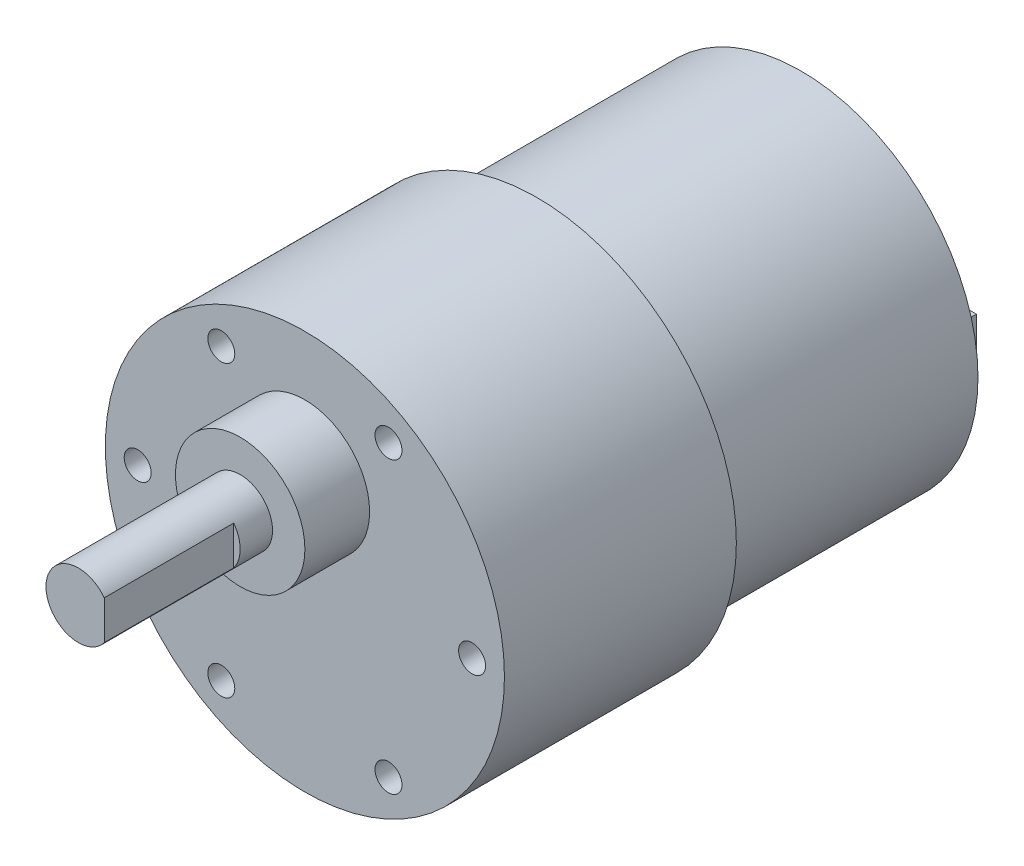
ISO-10303-21;
HEADER;
FILE_DESCRIPTION(('STEP AP214'),'2;1');
FILE_NAME('part.step','',(''),(''),'','','');
FILE_SCHEMA(('AUTOMOTIVE_DESIGN { 1 0 10303 214 1 1 1 1 }'));
ENDSEC;
DATA;
#1=APPLICATION_CONTEXT('core data for automotive mechanical design processes');
#2=APPLICATION_PROTOCOL_DEFINITION('international standard','automotive_design',2000,#1);
#3=PRODUCT_CONTEXT('',#1,'mechanical');
#4=PRODUCT('Part','Part','',(#3));
#5=PRODUCT_RELATED_PRODUCT_CATEGORY('part','',(#4));
#6=PRODUCT_DEFINITION_FORMATION('','',#4);
#7=PRODUCT_DEFINITION_CONTEXT('part definition',#1,'design');
#8=PRODUCT_DEFINITION('design','',#6,#7);
#9=PRODUCT_DEFINITION_SHAPE('','',#8);
#10=(LENGTH_UNIT() NAMED_UNIT(*) SI_UNIT(.MILLI.,.METRE.));
#11=(NAMED_UNIT(*) PLANE_ANGLE_UNIT() SI_UNIT($,.RADIAN.));
#12=(NAMED_UNIT(*) SI_UNIT($,.STERADIAN.) SOLID_ANGLE_UNIT());
#13=UNCERTAINTY_MEASURE_WITH_UNIT(LENGTH_MEASURE(1.E-05),#10,'distance_accuracy_value','');
#14=(GEOMETRIC_REPRESENTATION_CONTEXT(3) GLOBAL_UNCERTAINTY_ASSIGNED_CONTEXT((#13)) GLOBAL_UNIT_ASSIGNED_CONTEXT((#10,
#11,#12)) REPRESENTATION_CONTEXT('',''));
#15=CARTESIAN_POINT('',(0.,0.,0.));
#16=DIRECTION('',(0.,0.,1.));
#17=DIRECTION('',(1.,0.,0.));
#18=AXIS2_PLACEMENT_3D('',#15,#16,#17);
#19=CARTESIAN_POINT('',(0.,0.,-46.));
#20=DIRECTION('',(0.,0.,1.));
#21=DIRECTION('',(1.,0.,0.));
#22=AXIS2_PLACEMENT_3D('',#19,#20,#21);
#23=PLANE('',#22);
#24=CARTESIAN_POINT('',(0.,0.,-46.));
#25=DIRECTION('',(0.,0.,1.));
#26=DIRECTION('',(1.,0.,0.));
#27=AXIS2_PLACEMENT_3D('',#24,#25,#26);
#28=CIRCLE('',#27,16.4);
#29=CARTESIAN_POINT('',(16.4,0.,-46.));
#30=VERTEX_POINT('',#29);
#31=EDGE_CURVE('E168',#30,#30,#28,.T.);
#32=ORIENTED_EDGE('',*,*,#31,.F.);
#33=EDGE_LOOP('',(#32));
#34=FACE_BOUND('',#33,.T.);
#35=DIRECTION('',(-1.,0.,0.));
#36=VECTOR('',#35,1.);
#37=CARTESIAN_POINT('',(-6.75,-4.5,-46.));
#38=LINE('',#37,#36);
#39=CARTESIAN_POINT('',(6.75,-4.5,-46.));
#40=VERTEX_POINT('',#39);
#41=CARTESIAN_POINT('',(5.03115294937453,-4.5,-46.));
#42=VERTEX_POINT('',#41);
#43=EDGE_CURVE('E133',#40,#42,#38,.T.);
#44=ORIENTED_EDGE('',*,*,#43,.T.);
#45=CARTESIAN_POINT('',(0.,0.,-46.));
#46=DIRECTION('',(0.,0.,1.));
#47=DIRECTION('',(1.,0.,0.));
#48=AXIS2_PLACEMENT_3D('',#45,#46,#47);
#49=CIRCLE('',#48,6.75);
#50=CARTESIAN_POINT('',(-5.03115294937453,-4.5,-46.));
#51=VERTEX_POINT('',#50);
#52=EDGE_CURVE('E165',#42,#51,#49,.T.);
#53=ORIENTED_EDGE('',*,*,#52,.T.);
#54=CARTESIAN_POINT('',(-6.75,-4.5,-46.));
#55=VERTEX_POINT('',#54);
#56=EDGE_CURVE('E131',#51,#55,#38,.T.);
#57=ORIENTED_EDGE('',*,*,#56,.T.);
#58=DIRECTION('',(0.,-1.,0.));
#59=VECTOR('',#58,1.);
#60=CARTESIAN_POINT('',(-6.75,-11.5,-46.));
#61=LINE('',#60,#59);
#62=CARTESIAN_POINT('',(-6.75,-11.5,-46.));
#63=VERTEX_POINT('',#62);
#64=EDGE_CURVE('E135',#55,#63,#61,.T.);
#65=ORIENTED_EDGE('',*,*,#64,.T.);
#66=DIRECTION('',(1.,0.,0.));
#67=VECTOR('',#66,1.);
#68=CARTESIAN_POINT('',(-6.75,-11.5,-46.));
#69=LINE('',#68,#67);
#70=CARTESIAN_POINT('',(6.75,-11.5,-46.));
#71=VERTEX_POINT('',#70);
#72=EDGE_CURVE('E137',#63,#71,#69,.T.);
#73=ORIENTED_EDGE('',*,*,#72,.T.);
#74=DIRECTION('',(0.,1.,0.));
#75=VECTOR('',#74,1.);
#76=CARTESIAN_POINT('',(6.75,-11.5,-46.));
#77=LINE('',#76,#75);
#78=EDGE_CURVE('E58',#71,#40,#77,.T.);
#79=ORIENTED_EDGE('',*,*,#78,.T.);
#80=EDGE_LOOP('',(#44,#53,#57,#65,#73,#79));
#81=FACE_BOUND('',#80,.T.);
#82=ADVANCED_FACE('F35',(#34,#81),#23,.F.);
#83=CARTESIAN_POINT('',(0.,0.,-46.));
#84=DIRECTION('',(0.,0.,-1.));
#85=DIRECTION('',(-1.,0.,0.));
#86=AXIS2_PLACEMENT_3D('',#83,#84,#85);
#87=CYLINDRICAL_SURFACE('',#86,6.75);
#88=DIRECTION('',(0.,0.,-1.));
#89=VECTOR('',#88,1.);
#90=CARTESIAN_POINT('',(-5.03115294937453,-4.5,-46.));
#91=LINE('',#90,#89);
#92=CARTESIAN_POINT('',(-5.03115294937453,-4.5,-50.));
#93=VERTEX_POINT('',#92);
#94=EDGE_CURVE('E161',#51,#93,#91,.T.);
#95=ORIENTED_EDGE('',*,*,#94,.F.);
#96=ORIENTED_EDGE('',*,*,#52,.F.);
#97=DIRECTION('',(0.,0.,-1.));
#98=VECTOR('',#97,1.);
#99=CARTESIAN_POINT('',(5.03115294937453,-4.5,-46.));
#100=LINE('',#99,#98);
#101=CARTESIAN_POINT('',(5.03115294937453,-4.5,-50.));
#102=VERTEX_POINT('',#101);
#103=EDGE_CURVE('E158',#102,#42,#100,.F.);
#104=ORIENTED_EDGE('',*,*,#103,.F.);
#105=CARTESIAN_POINT('',(0.,0.,-50.));
#106=DIRECTION('',(0.,0.,1.));
#107=DIRECTION('',(1.,0.,0.));
#108=AXIS2_PLACEMENT_3D('',#105,#106,#107);
#109=CIRCLE('',#108,6.75);
#110=EDGE_CURVE('E164',#102,#93,#109,.T.);
#111=ORIENTED_EDGE('',*,*,#110,.T.);
#112=EDGE_LOOP('',(#95,#96,#104,#111));
#113=FACE_BOUND('',#112,.T.);
#114=ADVANCED_FACE('F198',(#113),#87,.T.);
#115=CARTESIAN_POINT('',(0.,0.,-50.));
#116=DIRECTION('',(0.,0.,1.));
#117=DIRECTION('',(1.,0.,0.));
#118=AXIS2_PLACEMENT_3D('',#115,#116,#117);
#119=PLANE('',#118);
#120=DIRECTION('',(1.,0.,0.));
#121=VECTOR('',#120,1.);
#122=CARTESIAN_POINT('',(0.,-4.5,-50.));
#123=LINE('',#122,#121);
#124=EDGE_CURVE('E39',#93,#102,#123,.T.);
#125=ORIENTED_EDGE('',*,*,#124,.F.);
#126=ORIENTED_EDGE('',*,*,#110,.F.);
#127=EDGE_LOOP('',(#125,#126));
#128=FACE_BOUND('',#127,.T.);
#129=ADVANCED_FACE('F204',(#128),#119,.F.);
#130=CARTESIAN_POINT('',(0.,0.,0.));
#131=DIRECTION('',(0.,0.,-1.));
#132=DIRECTION('',(-1.,0.,0.));
#133=AXIS2_PLACEMENT_3D('',#130,#131,#132);
#134=CYLINDRICAL_SURFACE('',#133,18.5);
#135=CARTESIAN_POINT('',(0.,0.,0.));
#136=DIRECTION('',(0.,0.,1.));
#137=DIRECTION('',(1.,0.,0.));
#138=AXIS2_PLACEMENT_3D('',#135,#136,#137);
#139=CIRCLE('',#138,18.5);
#140=CARTESIAN_POINT('',(18.5,0.,0.));
#141=VERTEX_POINT('',#140);
#142=EDGE_CURVE('E177',#141,#141,#139,.T.);
#143=ORIENTED_EDGE('',*,*,#142,.F.);
#144=EDGE_LOOP('',(#143));
#145=FACE_BOUND('',#144,.T.);
#146=CARTESIAN_POINT('',(0.,0.,-21.5));
#147=DIRECTION('',(0.,0.,1.));
#148=DIRECTION('',(1.,0.,0.));
#149=AXIS2_PLACEMENT_3D('',#146,#147,#148);
#150=CIRCLE('',#149,18.5);
#151=CARTESIAN_POINT('',(18.5,0.,-21.5));
#152=VERTEX_POINT('',#151);
#153=EDGE_CURVE('E176',#152,#152,#150,.T.);
#154=ORIENTED_EDGE('',*,*,#153,.T.);
#155=EDGE_LOOP('',(#154));
#156=FACE_BOUND('',#155,.T.);
#157=ADVANCED_FACE('F37',(#145,#156),#134,.T.);
#158=CARTESIAN_POINT('',(0.,0.,0.));
#159=DIRECTION('',(0.,0.,1.));
#160=DIRECTION('',(1.,0.,0.));
#161=AXIS2_PLACEMENT_3D('',#158,#159,#160);
#162=PLANE('',#161);
#163=CARTESIAN_POINT('',(15.5,0.,0.));
#164=DIRECTION('',(0.,0.,1.));
#165=DIRECTION('',(1.,0.,0.));
#166=AXIS2_PLACEMENT_3D('',#163,#164,#165);
#167=CIRCLE('',#166,1.25);
#168=CARTESIAN_POINT('',(16.75,0.,0.));
#169=VERTEX_POINT('',#168);
#170=EDGE_CURVE('E300',#169,#169,#167,.T.);
#171=ORIENTED_EDGE('',*,*,#170,.F.);
#172=EDGE_LOOP('',(#171));
#173=FACE_BOUND('',#172,.T.);
#174=CARTESIAN_POINT('',(7.75,-13.4233937586588,0.));
#175=DIRECTION('',(0.,0.,1.));
#176=DIRECTION('',(1.,0.,0.));
#177=AXIS2_PLACEMENT_3D('',#174,#175,#176);
#178=CIRCLE('',#177,1.25);
#179=CARTESIAN_POINT('',(9.,-13.4233937586588,0.));
#180=VERTEX_POINT('',#179);
#181=EDGE_CURVE('E310',#180,#180,#178,.T.);
#182=ORIENTED_EDGE('',*,*,#181,.F.);
#183=EDGE_LOOP('',(#182));
#184=FACE_BOUND('',#183,.T.);
#185=CARTESIAN_POINT('',(-7.75,-13.4233937586588,0.));
#186=DIRECTION('',(0.,0.,1.));
#187=DIRECTION('',(1.,0.,0.));
#188=AXIS2_PLACEMENT_3D('',#185,#186,#187);
#189=CIRCLE('',#188,1.24999999999999);
#190=CARTESIAN_POINT('',(-6.50000000000001,-13.4233937586588,0.));
#191=VERTEX_POINT('',#190);
#192=EDGE_CURVE('E309',#191,#191,#189,.T.);
#193=ORIENTED_EDGE('',*,*,#192,.F.);
#194=EDGE_LOOP('',(#193));
#195=FACE_BOUND('',#194,.T.);
#196=CARTESIAN_POINT('',(-15.5,0.,0.));
#197=DIRECTION('',(0.,0.,1.));
#198=DIRECTION('',(1.,0.,0.));
#199=AXIS2_PLACEMENT_3D('',#196,#197,#198);
#200=CIRCLE('',#199,1.25);
#201=CARTESIAN_POINT('',(-14.25,0.,0.));
#202=VERTEX_POINT('',#201);
#203=EDGE_CURVE('E327',#202,#202,#200,.T.);
#204=ORIENTED_EDGE('',*,*,#203,.F.);
#205=EDGE_LOOP('',(#204));
#206=FACE_BOUND('',#205,.T.);
#207=CARTESIAN_POINT('',(-7.75,13.4233937586588,0.));
#208=DIRECTION('',(0.,0.,1.));
#209=DIRECTION('',(1.,0.,0.));
#210=AXIS2_PLACEMENT_3D('',#207,#208,#209);
#211=CIRCLE('',#210,1.25);
#212=CARTESIAN_POINT('',(-6.5,13.4233937586588,0.));
#213=VERTEX_POINT('',#212);
#214=EDGE_CURVE('E321',#213,#213,#211,.T.);
#215=ORIENTED_EDGE('',*,*,#214,.F.);
#216=EDGE_LOOP('',(#215));
#217=FACE_BOUND('',#216,.T.);
#218=CARTESIAN_POINT('',(7.75,13.4233937586588,0.));
#219=DIRECTION('',(0.,0.,1.));
#220=DIRECTION('',(1.,0.,0.));
#221=AXIS2_PLACEMENT_3D('',#218,#219,#220);
#222=CIRCLE('',#221,1.25);
#223=CARTESIAN_POINT('',(9.,13.4233937586588,0.));
#224=VERTEX_POINT('',#223);
#225=EDGE_CURVE('E315',#224,#224,#222,.T.);
#226=ORIENTED_EDGE('',*,*,#225,.F.);
#227=EDGE_LOOP('',(#226));
#228=FACE_BOUND('',#227,.T.);
#229=CARTESIAN_POINT('',(0.,7.,0.));
#230=DIRECTION('',(0.,0.,1.));
#231=DIRECTION('',(1.,0.,0.));
#232=AXIS2_PLACEMENT_3D('',#229,#230,#231);
#233=CIRCLE('',#232,6.);
#234=CARTESIAN_POINT('',(6.,7.,0.));
#235=VERTEX_POINT('',#234);
#236=EDGE_CURVE('E119',#235,#235,#233,.T.);
#237=ORIENTED_EDGE('',*,*,#236,.F.);
#238=EDGE_LOOP('',(#237));
#239=FACE_BOUND('',#238,.T.);
#240=ORIENTED_EDGE('',*,*,#142,.T.);
#241=EDGE_LOOP('',(#240));
#242=FACE_BOUND('',#241,.T.);
#243=ADVANCED_FACE('F186',(#173,#184,#195,#206,#217,#228,#239,#242),#162,.T.);
#244=CARTESIAN_POINT('',(0.,0.,-21.5));
#245=DIRECTION('',(0.,0.,1.));
#246=DIRECTION('',(1.,0.,0.));
#247=AXIS2_PLACEMENT_3D('',#244,#245,#246);
#248=PLANE('',#247);
#249=CARTESIAN_POINT('',(0.,0.,-21.5));
#250=DIRECTION('',(0.,0.,1.));
#251=DIRECTION('',(1.,0.,0.));
#252=AXIS2_PLACEMENT_3D('',#249,#250,#251);
#253=CIRCLE('',#252,16.4);
#254=CARTESIAN_POINT('',(16.4,0.,-21.5));
#255=VERTEX_POINT('',#254);
#256=EDGE_CURVE('E173',#255,#255,#253,.T.);
#257=ORIENTED_EDGE('',*,*,#256,.T.);
#258=EDGE_LOOP('',(#257));
#259=FACE_BOUND('',#258,.T.);
#260=ORIENTED_EDGE('',*,*,#153,.F.);
#261=EDGE_LOOP('',(#260));
#262=FACE_BOUND('',#261,.T.);
#263=ADVANCED_FACE('F183',(#259,#262),#248,.F.);
#264=CARTESIAN_POINT('',(0.,0.,-21.5));
#265=DIRECTION('',(0.,0.,-1.));
#266=DIRECTION('',(-1.,0.,0.));
#267=AXIS2_PLACEMENT_3D('',#264,#265,#266);
#268=CYLINDRICAL_SURFACE('',#267,16.4);
#269=ORIENTED_EDGE('',*,*,#256,.F.);
#270=EDGE_LOOP('',(#269));
#271=FACE_BOUND('',#270,.T.);
#272=ORIENTED_EDGE('',*,*,#31,.T.);
#273=EDGE_LOOP('',(#272));
#274=FACE_BOUND('',#273,.T.);
#275=ADVANCED_FACE('F185',(#271,#274),#268,.T.);
#276=CARTESIAN_POINT('',(-6.75,-4.5,-46.));
#277=DIRECTION('',(0.,-1.,0.));
#278=DIRECTION('',(0.,0.,-1.));
#279=AXIS2_PLACEMENT_3D('',#276,#277,#278);
#280=PLANE('',#279);
#281=ORIENTED_EDGE('',*,*,#56,.F.);
#282=ORIENTED_EDGE('',*,*,#94,.T.);
#283=ORIENTED_EDGE('',*,*,#124,.T.);
#284=ORIENTED_EDGE('',*,*,#103,.T.);
#285=ORIENTED_EDGE('',*,*,#43,.F.);
#286=DIRECTION('',(0.,0.,-1.));
#287=VECTOR('',#286,1.);
#288=CARTESIAN_POINT('',(6.75,-4.5,-46.));
#289=LINE('',#288,#287);
#290=CARTESIAN_POINT('',(6.75,-4.5,-55.5));
#291=VERTEX_POINT('',#290);
#292=EDGE_CURVE('E155',#40,#291,#289,.T.);
#293=ORIENTED_EDGE('',*,*,#292,.T.);
#294=DIRECTION('',(-1.,0.,0.));
#295=VECTOR('',#294,1.);
#296=CARTESIAN_POINT('',(-6.75,-4.5,-55.5));
#297=LINE('',#296,#295);
#298=CARTESIAN_POINT('',(-6.75,-4.5,-55.5));
#299=VERTEX_POINT('',#298);
#300=EDGE_CURVE('E142',#291,#299,#297,.T.);
#301=ORIENTED_EDGE('',*,*,#300,.T.);
#302=DIRECTION('',(0.,0.,-1.));
#303=VECTOR('',#302,1.);
#304=CARTESIAN_POINT('',(-6.75,-4.5,-46.));
#305=LINE('',#304,#303);
#306=EDGE_CURVE('E152',#55,#299,#305,.T.);
#307=ORIENTED_EDGE('',*,*,#306,.F.);
#308=EDGE_LOOP('',(#281,#282,#283,#284,#285,#293,#301,#307));
#309=FACE_BOUND('',#308,.T.);
#310=ADVANCED_FACE('F192',(#309),#280,.F.);
#311=CARTESIAN_POINT('',(6.75,-11.5,-46.));
#312=DIRECTION('',(-1.,0.,0.));
#313=DIRECTION('',(0.,0.,1.));
#314=AXIS2_PLACEMENT_3D('',#311,#312,#313);
#315=PLANE('',#314);
#316=DIRECTION('',(0.,1.,0.));
#317=VECTOR('',#316,1.);
#318=CARTESIAN_POINT('',(6.75,-11.5,-55.5));
#319=LINE('',#318,#317);
#320=CARTESIAN_POINT('',(6.75,-11.5,-55.5));
#321=VERTEX_POINT('',#320);
#322=EDGE_CURVE('E127',#321,#291,#319,.T.);
#323=ORIENTED_EDGE('',*,*,#322,.T.);
#324=ORIENTED_EDGE('',*,*,#292,.F.);
#325=ORIENTED_EDGE('',*,*,#78,.F.);
#326=DIRECTION('',(0.,0.,-1.));
#327=VECTOR('',#326,1.);
#328=CARTESIAN_POINT('',(6.75,-11.5,-46.));
#329=LINE('',#328,#327);
#330=EDGE_CURVE('E139',#71,#321,#329,.T.);
#331=ORIENTED_EDGE('',*,*,#330,.T.);
#332=EDGE_LOOP('',(#323,#324,#325,#331));
#333=FACE_BOUND('',#332,.T.);
#334=ADVANCED_FACE('F212',(#333),#315,.F.);
#335=CARTESIAN_POINT('',(-6.75,-11.5,-46.));
#336=DIRECTION('',(1.,0.,0.));
#337=DIRECTION('',(0.,0.,-1.));
#338=AXIS2_PLACEMENT_3D('',#335,#336,#337);
#339=PLANE('',#338);
#340=DIRECTION('',(0.,-1.,0.));
#341=VECTOR('',#340,1.);
#342=CARTESIAN_POINT('',(-6.75,-11.5,-55.5));
#343=LINE('',#342,#341);
#344=CARTESIAN_POINT('',(-6.75,-11.5,-55.5));
#345=VERTEX_POINT('',#344);
#346=EDGE_CURVE('E144',#299,#345,#343,.T.);
#347=ORIENTED_EDGE('',*,*,#346,.T.);
#348=DIRECTION('',(0.,0.,-1.));
#349=VECTOR('',#348,1.);
#350=CARTESIAN_POINT('',(-6.75,-11.5,-46.));
#351=LINE('',#350,#349);
#352=EDGE_CURVE('E149',#63,#345,#351,.T.);
#353=ORIENTED_EDGE('',*,*,#352,.F.);
#354=ORIENTED_EDGE('',*,*,#64,.F.);
#355=ORIENTED_EDGE('',*,*,#306,.T.);
#356=EDGE_LOOP('',(#347,#353,#354,#355));
#357=FACE_BOUND('',#356,.T.);
#358=ADVANCED_FACE('F215',(#357),#339,.F.);
#359=CARTESIAN_POINT('',(-6.75,-11.5,-46.));
#360=DIRECTION('',(0.,1.,0.));
#361=DIRECTION('',(0.,0.,1.));
#362=AXIS2_PLACEMENT_3D('',#359,#360,#361);
#363=PLANE('',#362);
#364=DIRECTION('',(1.,0.,0.));
#365=VECTOR('',#364,1.);
#366=CARTESIAN_POINT('',(-6.75,-11.5,-55.5));
#367=LINE('',#366,#365);
#368=EDGE_CURVE('E132',#345,#321,#367,.T.);
#369=ORIENTED_EDGE('',*,*,#368,.T.);
#370=ORIENTED_EDGE('',*,*,#330,.F.);
#371=ORIENTED_EDGE('',*,*,#72,.F.);
#372=ORIENTED_EDGE('',*,*,#352,.T.);
#373=EDGE_LOOP('',(#369,#370,#371,#372));
#374=FACE_BOUND('',#373,.T.);
#375=ADVANCED_FACE('F222',(#374),#363,.F.);
#376=CARTESIAN_POINT('',(0.,0.,-55.5));
#377=DIRECTION('',(0.,0.,-1.));
#378=DIRECTION('',(-1.,0.,0.));
#379=AXIS2_PLACEMENT_3D('',#376,#377,#378);
#380=PLANE('',#379);
#381=ORIENTED_EDGE('',*,*,#322,.F.);
#382=ORIENTED_EDGE('',*,*,#368,.F.);
#383=ORIENTED_EDGE('',*,*,#346,.F.);
#384=ORIENTED_EDGE('',*,*,#300,.F.);
#385=EDGE_LOOP('',(#381,#382,#383,#384));
#386=FACE_BOUND('',#385,.T.);
#387=ADVANCED_FACE('F226',(#386),#380,.T.);
#388=CARTESIAN_POINT('',(0.,7.,6.));
#389=DIRECTION('',(0.,0.,-1.));
#390=DIRECTION('',(-1.,0.,0.));
#391=AXIS2_PLACEMENT_3D('',#388,#389,#390);
#392=CYLINDRICAL_SURFACE('',#391,6.);
#393=CARTESIAN_POINT('',(0.,7.,6.));
#394=DIRECTION('',(0.,0.,1.));
#395=DIRECTION('',(1.,0.,0.));
#396=AXIS2_PLACEMENT_3D('',#393,#394,#395);
#397=CIRCLE('',#396,6.);
#398=CARTESIAN_POINT('',(6.,7.,6.));
#399=VERTEX_POINT('',#398);
#400=EDGE_CURVE('E124',#399,#399,#397,.T.);
#401=ORIENTED_EDGE('',*,*,#400,.F.);
#402=EDGE_LOOP('',(#401));
#403=FACE_BOUND('',#402,.T.);
#404=ORIENTED_EDGE('',*,*,#236,.T.);
#405=EDGE_LOOP('',(#404));
#406=FACE_BOUND('',#405,.T.);
#407=ADVANCED_FACE('F230',(#403,#406),#392,.T.);
#408=CARTESIAN_POINT('',(0.,7.,6.));
#409=DIRECTION('',(0.,0.,1.));
#410=DIRECTION('',(1.,0.,0.));
#411=AXIS2_PLACEMENT_3D('',#408,#409,#410);
#412=PLANE('',#411);
#413=CARTESIAN_POINT('',(0.,7.,6.));
#414=DIRECTION('',(0.,0.,1.));
#415=DIRECTION('',(1.,0.,0.));
#416=AXIS2_PLACEMENT_3D('',#413,#414,#415);
#417=CIRCLE('',#416,3.);
#418=CARTESIAN_POINT('',(3.,7.,6.));
#419=VERTEX_POINT('',#418);
#420=EDGE_CURVE('E11',#419,#419,#417,.T.);
#421=ORIENTED_EDGE('',*,*,#420,.F.);
#422=EDGE_LOOP('',(#421));
#423=FACE_BOUND('',#422,.T.);
#424=ORIENTED_EDGE('',*,*,#400,.T.);
#425=EDGE_LOOP('',(#424));
#426=FACE_BOUND('',#425,.T.);
#427=ADVANCED_FACE('F234',(#423,#426),#412,.T.);
#428=CARTESIAN_POINT('',(0.,7.,9.));
#429=DIRECTION('',(0.,0.,-1.));
#430=DIRECTION('',(-1.,0.,0.));
#431=AXIS2_PLACEMENT_3D('',#428,#429,#430);
#432=CYLINDRICAL_SURFACE('',#431,3.);
#433=CARTESIAN_POINT('',(0.,7.,9.));
#434=DIRECTION('',(0.,0.,1.));
#435=DIRECTION('',(1.,0.,0.));
#436=AXIS2_PLACEMENT_3D('',#433,#434,#435);
#437=CIRCLE('',#436,3.);
#438=CARTESIAN_POINT('',(2.4,5.2,9.));
#439=VERTEX_POINT('',#438);
#440=CARTESIAN_POINT('',(2.4,8.8,9.));
#441=VERTEX_POINT('',#440);
#442=EDGE_CURVE('E117',#439,#441,#437,.T.);
#443=ORIENTED_EDGE('',*,*,#442,.F.);
#444=DIRECTION('',(0.,0.,-1.));
#445=VECTOR('',#444,1.);
#446=CARTESIAN_POINT('',(2.4,5.2,21.));
#447=LINE('',#446,#445);
#448=CARTESIAN_POINT('',(2.4,5.2,21.));
#449=VERTEX_POINT('',#448);
#450=EDGE_CURVE('E105',#449,#439,#447,.T.);
#451=ORIENTED_EDGE('',*,*,#450,.F.);
#452=CARTESIAN_POINT('',(0.,7.,21.));
#453=DIRECTION('',(0.,0.,1.));
#454=DIRECTION('',(1.,0.,0.));
#455=AXIS2_PLACEMENT_3D('',#452,#453,#454);
#456=CIRCLE('',#455,3.);
#457=CARTESIAN_POINT('',(2.4,8.8,21.));
#458=VERTEX_POINT('',#457);
#459=EDGE_CURVE('E110',#458,#449,#456,.T.);
#460=ORIENTED_EDGE('',*,*,#459,.F.);
#461=DIRECTION('',(0.,0.,-1.));
#462=VECTOR('',#461,1.);
#463=CARTESIAN_POINT('',(2.4,8.8,21.));
#464=LINE('',#463,#462);
#465=EDGE_CURVE('E107',#458,#441,#464,.T.);
#466=ORIENTED_EDGE('',*,*,#465,.T.);
#467=EDGE_LOOP('',(#443,#451,#460,#466));
#468=FACE_BOUND('',#467,.T.);
#469=ORIENTED_EDGE('',*,*,#420,.T.);
#470=EDGE_LOOP('',(#469));
#471=FACE_BOUND('',#470,.T.);
#472=ADVANCED_FACE('F115',(#468,#471),#432,.T.);
#473=CARTESIAN_POINT('',(0.,7.,9.));
#474=DIRECTION('',(0.,0.,1.));
#475=DIRECTION('',(1.,0.,0.));
#476=AXIS2_PLACEMENT_3D('',#473,#474,#475);
#477=PLANE('',#476);
#478=DIRECTION('',(0.,1.,0.));
#479=VECTOR('',#478,1.);
#480=CARTESIAN_POINT('',(2.4,5.2,9.));
#481=LINE('',#480,#479);
#482=EDGE_CURVE('E50',#439,#441,#481,.T.);
#483=ORIENTED_EDGE('',*,*,#482,.F.);
#484=ORIENTED_EDGE('',*,*,#442,.T.);
#485=EDGE_LOOP('',(#483,#484));
#486=FACE_BOUND('',#485,.T.);
#487=ADVANCED_FACE('F241',(#486),#477,.T.);
#488=CARTESIAN_POINT('',(2.4,5.2,21.));
#489=DIRECTION('',(-1.,0.,0.));
#490=DIRECTION('',(0.,0.,1.));
#491=AXIS2_PLACEMENT_3D('',#488,#489,#490);
#492=PLANE('',#491);
#493=ORIENTED_EDGE('',*,*,#482,.T.);
#494=ORIENTED_EDGE('',*,*,#465,.F.);
#495=DIRECTION('',(0.,1.,0.));
#496=VECTOR('',#495,1.);
#497=CARTESIAN_POINT('',(2.4,5.2,21.));
#498=LINE('',#497,#496);
#499=EDGE_CURVE('E101',#449,#458,#498,.T.);
#500=ORIENTED_EDGE('',*,*,#499,.F.);
#501=ORIENTED_EDGE('',*,*,#450,.T.);
#502=EDGE_LOOP('',(#493,#494,#500,#501));
#503=FACE_BOUND('',#502,.T.);
#504=ADVANCED_FACE('F103',(#503),#492,.F.);
#505=CARTESIAN_POINT('',(0.,7.,21.));
#506=DIRECTION('',(0.,0.,1.));
#507=DIRECTION('',(1.,0.,0.));
#508=AXIS2_PLACEMENT_3D('',#505,#506,#507);
#509=PLANE('',#508);
#510=ORIENTED_EDGE('',*,*,#459,.T.);
#511=ORIENTED_EDGE('',*,*,#499,.T.);
#512=EDGE_LOOP('',(#510,#511));
#513=FACE_BOUND('',#512,.T.);
#514=ADVANCED_FACE('F112',(#513),#509,.T.);
#515=CARTESIAN_POINT('',(7.75,13.4233937586588,-3.));
#516=DIRECTION('',(0.,0.,1.));
#517=DIRECTION('',(1.,0.,0.));
#518=AXIS2_PLACEMENT_3D('',#515,#516,#517);
#519=CYLINDRICAL_SURFACE('',#518,1.25);
#520=CARTESIAN_POINT('',(7.75,13.4233937586588,-3.));
#521=DIRECTION('',(0.,0.,1.));
#522=DIRECTION('',(1.,0.,0.));
#523=AXIS2_PLACEMENT_3D('',#520,#521,#522);
#524=CIRCLE('',#523,1.25);
#525=CARTESIAN_POINT('',(9.,13.4233937586588,-3.));
#526=VERTEX_POINT('',#525);
#527=EDGE_CURVE('E303',#526,#526,#524,.T.);
#528=ORIENTED_EDGE('',*,*,#527,.F.);
#529=EDGE_LOOP('',(#528));
#530=FACE_BOUND('',#529,.T.);
#531=ORIENTED_EDGE('',*,*,#225,.T.);
#532=EDGE_LOOP('',(#531));
#533=FACE_BOUND('',#532,.T.);
#534=ADVANCED_FACE('F248',(#530,#533),#519,.F.);
#535=CARTESIAN_POINT('',(7.75,13.4233937586588,-3.));
#536=DIRECTION('',(0.,0.,1.));
#537=DIRECTION('',(1.,0.,0.));
#538=AXIS2_PLACEMENT_3D('',#535,#536,#537);
#539=PLANE('',#538);
#540=ORIENTED_EDGE('',*,*,#527,.T.);
#541=EDGE_LOOP('',(#540));
#542=FACE_BOUND('',#541,.T.);
#543=ADVANCED_FACE('F270',(#542),#539,.T.);
#544=CARTESIAN_POINT('',(-7.75,13.4233937586588,-3.));
#545=DIRECTION('',(0.,0.,1.));
#546=DIRECTION('',(1.,0.,0.));
#547=AXIS2_PLACEMENT_3D('',#544,#545,#546);
#548=CYLINDRICAL_SURFACE('',#547,1.25);
#549=CARTESIAN_POINT('',(-7.75,13.4233937586588,-3.));
#550=DIRECTION('',(0.,0.,1.));
#551=DIRECTION('',(1.,0.,0.));
#552=AXIS2_PLACEMENT_3D('',#549,#550,#551);
#553=CIRCLE('',#552,1.25);
#554=CARTESIAN_POINT('',(-6.5,13.4233937586588,-3.));
#555=VERTEX_POINT('',#554);
#556=EDGE_CURVE('E318',#555,#555,#553,.T.);
#557=ORIENTED_EDGE('',*,*,#556,.F.);
#558=EDGE_LOOP('',(#557));
#559=FACE_BOUND('',#558,.T.);
#560=ORIENTED_EDGE('',*,*,#214,.T.);
#561=EDGE_LOOP('',(#560));
#562=FACE_BOUND('',#561,.T.);
#563=ADVANCED_FACE('F267',(#559,#562),#548,.F.);
#564=CARTESIAN_POINT('',(-7.75,13.4233937586588,-3.));
#565=DIRECTION('',(0.,0.,1.));
#566=DIRECTION('',(1.,0.,0.));
#567=AXIS2_PLACEMENT_3D('',#564,#565,#566);
#568=PLANE('',#567);
#569=ORIENTED_EDGE('',*,*,#556,.T.);
#570=EDGE_LOOP('',(#569));
#571=FACE_BOUND('',#570,.T.);
#572=ADVANCED_FACE('F262',(#571),#568,.T.);
#573=CARTESIAN_POINT('',(-15.5,0.,-3.));
#574=DIRECTION('',(0.,0.,1.));
#575=DIRECTION('',(1.,0.,0.));
#576=AXIS2_PLACEMENT_3D('',#573,#574,#575);
#577=CYLINDRICAL_SURFACE('',#576,1.25);
#578=CARTESIAN_POINT('',(-15.5,0.,-3.));
#579=DIRECTION('',(0.,0.,1.));
#580=DIRECTION('',(1.,0.,0.));
#581=AXIS2_PLACEMENT_3D('',#578,#579,#580);
#582=CIRCLE('',#581,1.25);
#583=CARTESIAN_POINT('',(-14.25,0.,-3.));
#584=VERTEX_POINT('',#583);
#585=EDGE_CURVE('E324',#584,#584,#582,.T.);
#586=ORIENTED_EDGE('',*,*,#585,.F.);
#587=EDGE_LOOP('',(#586));
#588=FACE_BOUND('',#587,.T.);
#589=ORIENTED_EDGE('',*,*,#203,.T.);
#590=EDGE_LOOP('',(#589));
#591=FACE_BOUND('',#590,.T.);
#592=ADVANCED_FACE('F259',(#588,#591),#577,.F.);
#593=CARTESIAN_POINT('',(-15.5,0.,-3.));
#594=DIRECTION('',(0.,0.,1.));
#595=DIRECTION('',(1.,0.,0.));
#596=AXIS2_PLACEMENT_3D('',#593,#594,#595);
#597=PLANE('',#596);
#598=ORIENTED_EDGE('',*,*,#585,.T.);
#599=EDGE_LOOP('',(#598));
#600=FACE_BOUND('',#599,.T.);
#601=ADVANCED_FACE('F253',(#600),#597,.T.);
#602=CARTESIAN_POINT('',(-7.75,-13.4233937586588,-3.));
#603=DIRECTION('',(0.,0.,1.));
#604=DIRECTION('',(1.,0.,0.));
#605=AXIS2_PLACEMENT_3D('',#602,#603,#604);
#606=CYLINDRICAL_SURFACE('',#605,1.24999999999999);
#607=CARTESIAN_POINT('',(-7.75,-13.4233937586588,-3.));
#608=DIRECTION('',(0.,0.,1.));
#609=DIRECTION('',(1.,0.,0.));
#610=AXIS2_PLACEMENT_3D('',#607,#608,#609);
#611=CIRCLE('',#610,1.24999999999999);
#612=CARTESIAN_POINT('',(-6.50000000000001,-13.4233937586588,-3.));
#613=VERTEX_POINT('',#612);
#614=EDGE_CURVE('E330',#613,#613,#611,.T.);
#615=ORIENTED_EDGE('',*,*,#614,.F.);
#616=EDGE_LOOP('',(#615));
#617=FACE_BOUND('',#616,.T.);
#618=ORIENTED_EDGE('',*,*,#192,.T.);
#619=EDGE_LOOP('',(#618));
#620=FACE_BOUND('',#619,.T.);
#621=ADVANCED_FACE('F249',(#617,#620),#606,.F.);
#622=CARTESIAN_POINT('',(-7.75,-13.4233937586588,-3.));
#623=DIRECTION('',(0.,0.,1.));
#624=DIRECTION('',(1.,0.,0.));
#625=AXIS2_PLACEMENT_3D('',#622,#623,#624);
#626=PLANE('',#625);
#627=ORIENTED_EDGE('',*,*,#614,.T.);
#628=EDGE_LOOP('',(#627));
#629=FACE_BOUND('',#628,.T.);
#630=ADVANCED_FACE('F252',(#629),#626,.T.);
#631=CARTESIAN_POINT('',(7.75,-13.4233937586588,-3.));
#632=DIRECTION('',(0.,0.,1.));
#633=DIRECTION('',(1.,0.,0.));
#634=AXIS2_PLACEMENT_3D('',#631,#632,#633);
#635=CYLINDRICAL_SURFACE('',#634,1.25);
#636=CARTESIAN_POINT('',(7.75,-13.4233937586588,-3.));
#637=DIRECTION('',(0.,0.,1.));
#638=DIRECTION('',(1.,0.,0.));
#639=AXIS2_PLACEMENT_3D('',#636,#637,#638);
#640=CIRCLE('',#639,1.25);
#641=CARTESIAN_POINT('',(9.,-13.4233937586588,-3.));
#642=VERTEX_POINT('',#641);
#643=EDGE_CURVE('E306',#642,#642,#640,.T.);
#644=ORIENTED_EDGE('',*,*,#643,.F.);
#645=EDGE_LOOP('',(#644));
#646=FACE_BOUND('',#645,.T.);
#647=ORIENTED_EDGE('',*,*,#181,.T.);
#648=EDGE_LOOP('',(#647));
#649=FACE_BOUND('',#648,.T.);
#650=ADVANCED_FACE('F257',(#646,#649),#635,.F.);
#651=CARTESIAN_POINT('',(7.75,-13.4233937586588,-3.));
#652=DIRECTION('',(0.,0.,1.));
#653=DIRECTION('',(1.,0.,0.));
#654=AXIS2_PLACEMENT_3D('',#651,#652,#653);
#655=PLANE('',#654);
#656=ORIENTED_EDGE('',*,*,#643,.T.);
#657=EDGE_LOOP('',(#656));
#658=FACE_BOUND('',#657,.T.);
#659=ADVANCED_FACE('F283',(#658),#655,.T.);
#660=CARTESIAN_POINT('',(15.5,0.,-3.));
#661=DIRECTION('',(0.,0.,1.));
#662=DIRECTION('',(1.,0.,0.));
#663=AXIS2_PLACEMENT_3D('',#660,#661,#662);
#664=CYLINDRICAL_SURFACE('',#663,1.25);
#665=CARTESIAN_POINT('',(15.5,0.,-3.));
#666=DIRECTION('',(0.,0.,1.));
#667=DIRECTION('',(1.,0.,0.));
#668=AXIS2_PLACEMENT_3D('',#665,#666,#667);
#669=CIRCLE('',#668,1.25);
#670=CARTESIAN_POINT('',(16.75,0.,-3.));
#671=VERTEX_POINT('',#670);
#672=EDGE_CURVE('E299',#671,#671,#669,.T.);
#673=ORIENTED_EDGE('',*,*,#672,.F.);
#674=EDGE_LOOP('',(#673));
#675=FACE_BOUND('',#674,.T.);
#676=ORIENTED_EDGE('',*,*,#170,.T.);
#677=EDGE_LOOP('',(#676));
#678=FACE_BOUND('',#677,.T.);
#679=ADVANCED_FACE('F287',(#675,#678),#664,.F.);
#680=CARTESIAN_POINT('',(15.5,0.,-3.));
#681=DIRECTION('',(0.,0.,1.));
#682=DIRECTION('',(1.,0.,0.));
#683=AXIS2_PLACEMENT_3D('',#680,#681,#682);
#684=PLANE('',#683);
#685=ORIENTED_EDGE('',*,*,#672,.T.);
#686=EDGE_LOOP('',(#685));
#687=FACE_BOUND('',#686,.T.);
#688=ADVANCED_FACE('F291',(#687),#684,.T.);
#689=CLOSED_SHELL('',(#82,#114,#129,#157,#243,#263,#275,#310,#334,#358,#375,#387,#407,#427,#472,
#487,#504,#514,#534,#543,#563,#572,#592,#601,#621,#630,#650,#659,#679,#688));
#690=MANIFOLD_SOLID_BREP('B2',#689);
#691=ADVANCED_BREP_SHAPE_REPRESENTATION('',(#18,#690),#14);
#692=SHAPE_DEFINITION_REPRESENTATION(#9,#691);
ENDSEC;
END-ISO-10303-21;
